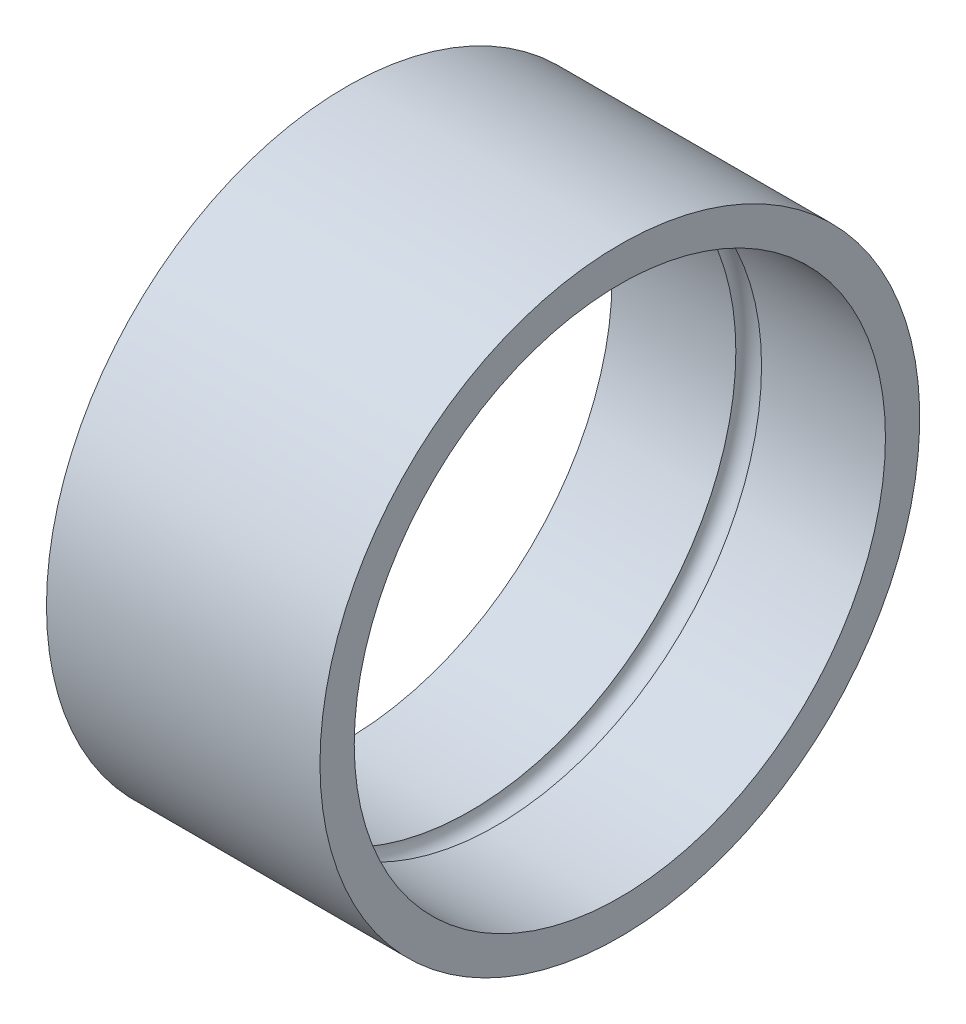
ISO-10303-21;
HEADER;
FILE_DESCRIPTION(('STEP AP214'),'2;1');
FILE_NAME('part.step','',(''),(''),'','','');
FILE_SCHEMA(('AUTOMOTIVE_DESIGN { 1 0 10303 214 1 1 1 1 }'));
ENDSEC;
DATA;
#1=APPLICATION_CONTEXT('core data for automotive mechanical design processes');
#2=APPLICATION_PROTOCOL_DEFINITION('international standard','automotive_design',2000,#1);
#3=PRODUCT_CONTEXT('',#1,'mechanical');
#4=PRODUCT('Part','Part','',(#3));
#5=PRODUCT_RELATED_PRODUCT_CATEGORY('part','',(#4));
#6=PRODUCT_DEFINITION_FORMATION('','',#4);
#7=PRODUCT_DEFINITION_CONTEXT('part definition',#1,'design');
#8=PRODUCT_DEFINITION('design','',#6,#7);
#9=PRODUCT_DEFINITION_SHAPE('','',#8);
#10=(LENGTH_UNIT() NAMED_UNIT(*) SI_UNIT(.MILLI.,.METRE.));
#11=(NAMED_UNIT(*) PLANE_ANGLE_UNIT() SI_UNIT($,.RADIAN.));
#12=(NAMED_UNIT(*) SI_UNIT($,.STERADIAN.) SOLID_ANGLE_UNIT());
#13=UNCERTAINTY_MEASURE_WITH_UNIT(LENGTH_MEASURE(1.E-05),#10,'distance_accuracy_value','');
#14=(GEOMETRIC_REPRESENTATION_CONTEXT(3) GLOBAL_UNCERTAINTY_ASSIGNED_CONTEXT((#13)) GLOBAL_UNIT_ASSIGNED_CONTEXT((#10,
#11,#12)) REPRESENTATION_CONTEXT('',''));
#15=CARTESIAN_POINT('',(0.,0.,0.));
#16=DIRECTION('',(0.,0.,1.));
#17=DIRECTION('',(1.,0.,0.));
#18=AXIS2_PLACEMENT_3D('',#15,#16,#17);
#19=CARTESIAN_POINT('',(-7.98,17.5,0.));
#20=DIRECTION('',(1.,0.,0.));
#21=DIRECTION('',(0.,0.,-1.));
#22=AXIS2_PLACEMENT_3D('',#19,#20,#21);
#23=PLANE('',#22);
#24=CARTESIAN_POINT('',(-7.98,0.,0.));
#25=DIRECTION('',(-1.,0.,0.));
#26=DIRECTION('',(0.,0.,1.));
#27=AXIS2_PLACEMENT_3D('',#24,#25,#26);
#28=CIRCLE('',#27,15.5);
#29=CARTESIAN_POINT('',(-7.98,0.,15.5));
#30=VERTEX_POINT('',#29);
#31=EDGE_CURVE('E10',#30,#30,#28,.T.);
#32=ORIENTED_EDGE('',*,*,#31,.F.);
#33=EDGE_LOOP('',(#32));
#34=FACE_BOUND('',#33,.T.);
#35=CARTESIAN_POINT('',(-7.98,0.,0.));
#36=DIRECTION('',(-1.,0.,0.));
#37=DIRECTION('',(0.,0.,1.));
#38=AXIS2_PLACEMENT_3D('',#35,#36,#37);
#39=CIRCLE('',#38,17.5);
#40=CARTESIAN_POINT('',(-7.98,0.,17.5));
#41=VERTEX_POINT('',#40);
#42=EDGE_CURVE('E59',#41,#41,#39,.T.);
#43=ORIENTED_EDGE('',*,*,#42,.T.);
#44=EDGE_LOOP('',(#43));
#45=FACE_BOUND('',#44,.T.);
#46=ADVANCED_FACE('F37',(#34,#45),#23,.F.);
#47=CARTESIAN_POINT('',(-7.98,0.,0.));
#48=DIRECTION('',(-1.,0.,0.));
#49=DIRECTION('',(0.,0.,1.));
#50=AXIS2_PLACEMENT_3D('',#47,#48,#49);
#51=CYLINDRICAL_SURFACE('',#50,15.5);
#52=CARTESIAN_POINT('',(-0.75,0.,0.));
#53=DIRECTION('',(-1.,0.,0.));
#54=DIRECTION('',(0.,0.,1.));
#55=AXIS2_PLACEMENT_3D('',#52,#53,#54);
#56=CIRCLE('',#55,15.5);
#57=CARTESIAN_POINT('',(-0.75,0.,15.5));
#58=VERTEX_POINT('',#57);
#59=EDGE_CURVE('E43',#58,#58,#56,.T.);
#60=ORIENTED_EDGE('',*,*,#59,.F.);
#61=EDGE_LOOP('',(#60));
#62=FACE_BOUND('',#61,.T.);
#63=ORIENTED_EDGE('',*,*,#31,.T.);
#64=EDGE_LOOP('',(#63));
#65=FACE_BOUND('',#64,.T.);
#66=ADVANCED_FACE('F84',(#62,#65),#51,.F.);
#67=CARTESIAN_POINT('',(0.,0.,0.));
#68=DIRECTION('',(-1.,0.,0.));
#69=DIRECTION('',(0.,0.,1.));
#70=AXIS2_PLACEMENT_3D('',#67,#68,#69);
#71=TOROIDAL_SURFACE('',#70,15.5,0.75);
#72=CARTESIAN_POINT('',(0.750000000000001,0.,0.));
#73=DIRECTION('',(-1.,0.,0.));
#74=DIRECTION('',(0.,0.,1.));
#75=AXIS2_PLACEMENT_3D('',#72,#73,#74);
#76=CIRCLE('',#75,15.5);
#77=CARTESIAN_POINT('',(0.750000000000001,0.,15.5));
#78=VERTEX_POINT('',#77);
#79=EDGE_CURVE('E47',#78,#78,#76,.T.);
#80=ORIENTED_EDGE('',*,*,#79,.F.);
#81=EDGE_LOOP('',(#80));
#82=FACE_BOUND('',#81,.T.);
#83=ORIENTED_EDGE('',*,*,#59,.T.);
#84=EDGE_LOOP('',(#83));
#85=FACE_BOUND('',#84,.T.);
#86=ADVANCED_FACE('F79',(#82,#85),#71,.F.);
#87=CARTESIAN_POINT('',(-7.98,0.,0.));
#88=DIRECTION('',(-1.,0.,0.));
#89=DIRECTION('',(0.,0.,1.));
#90=AXIS2_PLACEMENT_3D('',#87,#88,#89);
#91=CYLINDRICAL_SURFACE('',#90,15.5);
#92=CARTESIAN_POINT('',(7.98,0.,0.));
#93=DIRECTION('',(-1.,0.,0.));
#94=DIRECTION('',(0.,0.,1.));
#95=AXIS2_PLACEMENT_3D('',#92,#93,#94);
#96=CIRCLE('',#95,15.5);
#97=CARTESIAN_POINT('',(7.98,0.,15.5));
#98=VERTEX_POINT('',#97);
#99=EDGE_CURVE('E51',#98,#98,#96,.T.);
#100=ORIENTED_EDGE('',*,*,#99,.F.);
#101=EDGE_LOOP('',(#100));
#102=FACE_BOUND('',#101,.T.);
#103=ORIENTED_EDGE('',*,*,#79,.T.);
#104=EDGE_LOOP('',(#103));
#105=FACE_BOUND('',#104,.T.);
#106=ADVANCED_FACE('F73',(#102,#105),#91,.F.);
#107=CARTESIAN_POINT('',(7.98,17.5,0.));
#108=DIRECTION('',(-1.,0.,0.));
#109=DIRECTION('',(0.,0.,1.));
#110=AXIS2_PLACEMENT_3D('',#107,#108,#109);
#111=PLANE('',#110);
#112=CARTESIAN_POINT('',(7.98,0.,0.));
#113=DIRECTION('',(-1.,0.,0.));
#114=DIRECTION('',(0.,0.,1.));
#115=AXIS2_PLACEMENT_3D('',#112,#113,#114);
#116=CIRCLE('',#115,17.5);
#117=CARTESIAN_POINT('',(7.98,0.,17.5));
#118=VERTEX_POINT('',#117);
#119=EDGE_CURVE('E56',#118,#118,#116,.T.);
#120=ORIENTED_EDGE('',*,*,#119,.F.);
#121=EDGE_LOOP('',(#120));
#122=FACE_BOUND('',#121,.T.);
#123=ORIENTED_EDGE('',*,*,#99,.T.);
#124=EDGE_LOOP('',(#123));
#125=FACE_BOUND('',#124,.T.);
#126=ADVANCED_FACE('F67',(#122,#125),#111,.F.);
#127=CARTESIAN_POINT('',(-7.98,0.,0.));
#128=DIRECTION('',(-1.,0.,0.));
#129=DIRECTION('',(0.,0.,1.));
#130=AXIS2_PLACEMENT_3D('',#127,#128,#129);
#131=CYLINDRICAL_SURFACE('',#130,17.5);
#132=ORIENTED_EDGE('',*,*,#42,.F.);
#133=EDGE_LOOP('',(#132));
#134=FACE_BOUND('',#133,.T.);
#135=ORIENTED_EDGE('',*,*,#119,.T.);
#136=EDGE_LOOP('',(#135));
#137=FACE_BOUND('',#136,.T.);
#138=ADVANCED_FACE('F64',(#134,#137),#131,.T.);
#139=CLOSED_SHELL('',(#46,#66,#86,#106,#126,#138));
#140=MANIFOLD_SOLID_BREP('B2',#139);
#141=ADVANCED_BREP_SHAPE_REPRESENTATION('',(#18,#140),#14);
#142=SHAPE_DEFINITION_REPRESENTATION(#9,#141);
ENDSEC;
END-ISO-10303-21;
